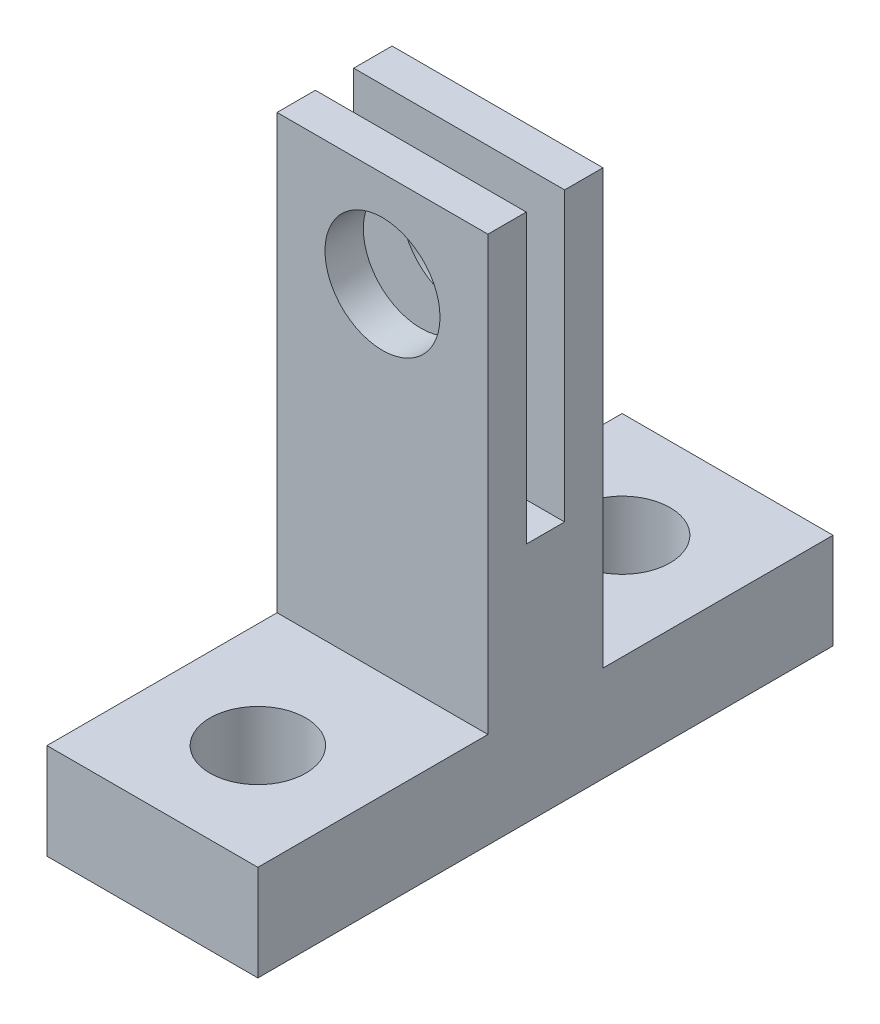
ISO-10303-21;
HEADER;
FILE_DESCRIPTION(('STEP AP214'),'2;1');
FILE_NAME('part.step','',(''),(''),'','','');
FILE_SCHEMA(('AUTOMOTIVE_DESIGN { 1 0 10303 214 1 1 1 1 }'));
ENDSEC;
DATA;
#1=APPLICATION_CONTEXT('core data for automotive mechanical design processes');
#2=APPLICATION_PROTOCOL_DEFINITION('international standard','automotive_design',2000,#1);
#3=PRODUCT_CONTEXT('',#1,'mechanical');
#4=PRODUCT('Part','Part','',(#3));
#5=PRODUCT_RELATED_PRODUCT_CATEGORY('part','',(#4));
#6=PRODUCT_DEFINITION_FORMATION('','',#4);
#7=PRODUCT_DEFINITION_CONTEXT('part definition',#1,'design');
#8=PRODUCT_DEFINITION('design','',#6,#7);
#9=PRODUCT_DEFINITION_SHAPE('','',#8);
#10=(LENGTH_UNIT() NAMED_UNIT(*) SI_UNIT(.MILLI.,.METRE.));
#11=(NAMED_UNIT(*) PLANE_ANGLE_UNIT() SI_UNIT($,.RADIAN.));
#12=(NAMED_UNIT(*) SI_UNIT($,.STERADIAN.) SOLID_ANGLE_UNIT());
#13=UNCERTAINTY_MEASURE_WITH_UNIT(LENGTH_MEASURE(1.E-05),#10,'distance_accuracy_value','');
#14=(GEOMETRIC_REPRESENTATION_CONTEXT(3) GLOBAL_UNCERTAINTY_ASSIGNED_CONTEXT((#13)) GLOBAL_UNIT_ASSIGNED_CONTEXT((#10,
#11,#12)) REPRESENTATION_CONTEXT('',''));
#15=CARTESIAN_POINT('',(0.,0.,0.));
#16=DIRECTION('',(0.,0.,1.));
#17=DIRECTION('',(1.,0.,0.));
#18=AXIS2_PLACEMENT_3D('',#15,#16,#17);
#19=CARTESIAN_POINT('',(2.75,7.5,0.500000000000001));
#20=DIRECTION('',(0.,-1.,0.));
#21=DIRECTION('',(0.,0.,-1.));
#22=AXIS2_PLACEMENT_3D('',#19,#20,#21);
#23=PLANE('',#22);
#24=DIRECTION('',(0.,0.,1.));
#25=VECTOR('',#24,1.);
#26=CARTESIAN_POINT('',(-2.75,7.5,0.500000000000001));
#27=LINE('',#26,#25);
#28=CARTESIAN_POINT('',(-2.75,7.5,0.500000000000001));
#29=VERTEX_POINT('',#28);
#30=CARTESIAN_POINT('',(-2.75,7.5,1.5));
#31=VERTEX_POINT('',#30);
#32=EDGE_CURVE('E154',#29,#31,#27,.T.);
#33=ORIENTED_EDGE('',*,*,#32,.T.);
#34=DIRECTION('',(-1.,0.,0.));
#35=VECTOR('',#34,1.);
#36=CARTESIAN_POINT('',(2.75,7.5,1.5));
#37=LINE('',#36,#35);
#38=CARTESIAN_POINT('',(2.75,7.5,1.5));
#39=VERTEX_POINT('',#38);
#40=EDGE_CURVE('E11',#39,#31,#37,.T.);
#41=ORIENTED_EDGE('',*,*,#40,.F.);
#42=DIRECTION('',(0.,0.,1.));
#43=VECTOR('',#42,1.);
#44=CARTESIAN_POINT('',(2.75,7.5,0.500000000000001));
#45=LINE('',#44,#43);
#46=CARTESIAN_POINT('',(2.75,7.5,0.500000000000001));
#47=VERTEX_POINT('',#46);
#48=EDGE_CURVE('E177',#47,#39,#45,.T.);
#49=ORIENTED_EDGE('',*,*,#48,.F.);
#50=DIRECTION('',(-1.,0.,0.));
#51=VECTOR('',#50,1.);
#52=CARTESIAN_POINT('',(2.75,7.5,0.500000000000001));
#53=LINE('',#52,#51);
#54=EDGE_CURVE('E150',#47,#29,#53,.T.);
#55=ORIENTED_EDGE('',*,*,#54,.T.);
#56=EDGE_LOOP('',(#33,#41,#49,#55));
#57=FACE_BOUND('',#56,.T.);
#58=ADVANCED_FACE('F33',(#57),#23,.F.);
#59=CARTESIAN_POINT('',(2.75,7.5,1.5));
#60=DIRECTION('',(0.,0.,-1.));
#61=DIRECTION('',(0.,1.,0.));
#62=AXIS2_PLACEMENT_3D('',#59,#60,#61);
#63=PLANE('',#62);
#64=CARTESIAN_POINT('',(0.,5.,1.5));
#65=DIRECTION('',(0.,0.,-1.));
#66=DIRECTION('',(0.,1.,0.));
#67=AXIS2_PLACEMENT_3D('',#64,#65,#66);
#68=CIRCLE('',#67,1.5);
#69=CARTESIAN_POINT('',(0.,6.5,1.5));
#70=VERTEX_POINT('',#69);
#71=EDGE_CURVE('E299',#70,#70,#68,.T.);
#72=ORIENTED_EDGE('',*,*,#71,.T.);
#73=EDGE_LOOP('',(#72));
#74=FACE_BOUND('',#73,.T.);
#75=DIRECTION('',(0.,-1.,0.));
#76=VECTOR('',#75,1.);
#77=CARTESIAN_POINT('',(-2.75,7.5,1.5));
#78=LINE('',#77,#76);
#79=CARTESIAN_POINT('',(-2.75,-3.8,1.5));
#80=VERTEX_POINT('',#79);
#81=EDGE_CURVE('E157',#31,#80,#78,.T.);
#82=ORIENTED_EDGE('',*,*,#81,.T.);
#83=DIRECTION('',(-1.,0.,0.));
#84=VECTOR('',#83,1.);
#85=CARTESIAN_POINT('',(2.75,-3.8,1.5));
#86=LINE('',#85,#84);
#87=CARTESIAN_POINT('',(2.75,-3.8,1.5));
#88=VERTEX_POINT('',#87);
#89=EDGE_CURVE('E42',#88,#80,#86,.T.);
#90=ORIENTED_EDGE('',*,*,#89,.F.);
#91=DIRECTION('',(0.,-1.,0.));
#92=VECTOR('',#91,1.);
#93=CARTESIAN_POINT('',(2.75,7.5,1.5));
#94=LINE('',#93,#92);
#95=EDGE_CURVE('E105',#39,#88,#94,.T.);
#96=ORIENTED_EDGE('',*,*,#95,.F.);
#97=ORIENTED_EDGE('',*,*,#40,.T.);
#98=EDGE_LOOP('',(#82,#90,#96,#97));
#99=FACE_BOUND('',#98,.T.);
#100=ADVANCED_FACE('F258',(#74,#99),#63,.F.);
#101=CARTESIAN_POINT('',(2.75,-3.8,7.5));
#102=DIRECTION('',(0.,-1.,0.));
#103=DIRECTION('',(0.,0.,-1.));
#104=AXIS2_PLACEMENT_3D('',#101,#102,#103);
#105=PLANE('',#104);
#106=CARTESIAN_POINT('',(0.,-3.8,4.75));
#107=DIRECTION('',(0.,1.,0.));
#108=DIRECTION('',(0.,0.,1.));
#109=AXIS2_PLACEMENT_3D('',#106,#107,#108);
#110=CIRCLE('',#109,1.25);
#111=CARTESIAN_POINT('',(0.,-3.8,6.));
#112=VERTEX_POINT('',#111);
#113=EDGE_CURVE('E306',#112,#112,#110,.T.);
#114=ORIENTED_EDGE('',*,*,#113,.F.);
#115=EDGE_LOOP('',(#114));
#116=FACE_BOUND('',#115,.T.);
#117=DIRECTION('',(0.,0.,1.));
#118=VECTOR('',#117,1.);
#119=CARTESIAN_POINT('',(-2.75,-3.8,7.5));
#120=LINE('',#119,#118);
#121=CARTESIAN_POINT('',(-2.75,-3.8,7.5));
#122=VERTEX_POINT('',#121);
#123=EDGE_CURVE('E160',#80,#122,#120,.T.);
#124=ORIENTED_EDGE('',*,*,#123,.T.);
#125=DIRECTION('',(-1.,0.,0.));
#126=VECTOR('',#125,1.);
#127=CARTESIAN_POINT('',(2.75,-3.8,7.5));
#128=LINE('',#127,#126);
#129=CARTESIAN_POINT('',(2.75,-3.8,7.5));
#130=VERTEX_POINT('',#129);
#131=EDGE_CURVE('E196',#130,#122,#128,.T.);
#132=ORIENTED_EDGE('',*,*,#131,.F.);
#133=DIRECTION('',(0.,0.,1.));
#134=VECTOR('',#133,1.);
#135=CARTESIAN_POINT('',(2.75,-3.8,7.5));
#136=LINE('',#135,#134);
#137=EDGE_CURVE('E205',#88,#130,#136,.T.);
#138=ORIENTED_EDGE('',*,*,#137,.F.);
#139=ORIENTED_EDGE('',*,*,#89,.T.);
#140=EDGE_LOOP('',(#124,#132,#138,#139));
#141=FACE_BOUND('',#140,.T.);
#142=ADVANCED_FACE('F203',(#116,#141),#105,.F.);
#143=CARTESIAN_POINT('',(2.75,-6.3,7.5));
#144=DIRECTION('',(0.,0.,-1.));
#145=DIRECTION('',(-1.,0.,0.));
#146=AXIS2_PLACEMENT_3D('',#143,#144,#145);
#147=PLANE('',#146);
#148=DIRECTION('',(0.,-1.,0.));
#149=VECTOR('',#148,1.);
#150=CARTESIAN_POINT('',(-2.75,-6.3,7.5));
#151=LINE('',#150,#149);
#152=CARTESIAN_POINT('',(-2.75,-6.3,7.5));
#153=VERTEX_POINT('',#152);
#154=EDGE_CURVE('E162',#122,#153,#151,.T.);
#155=ORIENTED_EDGE('',*,*,#154,.T.);
#156=DIRECTION('',(-1.,0.,0.));
#157=VECTOR('',#156,1.);
#158=CARTESIAN_POINT('',(2.75,-6.3,7.5));
#159=LINE('',#158,#157);
#160=CARTESIAN_POINT('',(2.75,-6.3,7.5));
#161=VERTEX_POINT('',#160);
#162=EDGE_CURVE('E193',#161,#153,#159,.T.);
#163=ORIENTED_EDGE('',*,*,#162,.F.);
#164=DIRECTION('',(0.,-1.,0.));
#165=VECTOR('',#164,1.);
#166=CARTESIAN_POINT('',(2.75,-6.3,7.5));
#167=LINE('',#166,#165);
#168=EDGE_CURVE('E223',#130,#161,#167,.T.);
#169=ORIENTED_EDGE('',*,*,#168,.F.);
#170=ORIENTED_EDGE('',*,*,#131,.T.);
#171=EDGE_LOOP('',(#155,#163,#169,#170));
#172=FACE_BOUND('',#171,.T.);
#173=ADVANCED_FACE('F214',(#172),#147,.F.);
#174=CARTESIAN_POINT('',(2.75,-6.3,7.5));
#175=DIRECTION('',(0.,1.,0.));
#176=DIRECTION('',(0.,0.,1.));
#177=AXIS2_PLACEMENT_3D('',#174,#175,#176);
#178=PLANE('',#177);
#179=CARTESIAN_POINT('',(0.,-6.3,4.75));
#180=DIRECTION('',(0.,1.,0.));
#181=DIRECTION('',(0.,0.,1.));
#182=AXIS2_PLACEMENT_3D('',#179,#180,#181);
#183=CIRCLE('',#182,1.25);
#184=CARTESIAN_POINT('',(0.,-6.3,6.));
#185=VERTEX_POINT('',#184);
#186=EDGE_CURVE('E158',#185,#185,#183,.T.);
#187=ORIENTED_EDGE('',*,*,#186,.T.);
#188=EDGE_LOOP('',(#187));
#189=FACE_BOUND('',#188,.T.);
#190=CARTESIAN_POINT('',(0.,-6.3,-4.75));
#191=DIRECTION('',(0.,1.,0.));
#192=DIRECTION('',(0.,0.,-1.));
#193=AXIS2_PLACEMENT_3D('',#190,#191,#192);
#194=CIRCLE('',#193,1.25);
#195=CARTESIAN_POINT('',(0.,-6.3,-6.));
#196=VERTEX_POINT('',#195);
#197=EDGE_CURVE('E309',#196,#196,#194,.T.);
#198=ORIENTED_EDGE('',*,*,#197,.T.);
#199=EDGE_LOOP('',(#198));
#200=FACE_BOUND('',#199,.T.);
#201=DIRECTION('',(0.,0.,-1.));
#202=VECTOR('',#201,1.);
#203=CARTESIAN_POINT('',(-2.75,-6.3,7.5));
#204=LINE('',#203,#202);
#205=CARTESIAN_POINT('',(-2.75,-6.3,-7.5));
#206=VERTEX_POINT('',#205);
#207=EDGE_CURVE('E164',#153,#206,#204,.T.);
#208=ORIENTED_EDGE('',*,*,#207,.T.);
#209=DIRECTION('',(-1.,0.,0.));
#210=VECTOR('',#209,1.);
#211=CARTESIAN_POINT('',(2.75,-6.3,-7.5));
#212=LINE('',#211,#210);
#213=CARTESIAN_POINT('',(2.75,-6.3,-7.5));
#214=VERTEX_POINT('',#213);
#215=EDGE_CURVE('E190',#214,#206,#212,.T.);
#216=ORIENTED_EDGE('',*,*,#215,.F.);
#217=DIRECTION('',(0.,0.,-1.));
#218=VECTOR('',#217,1.);
#219=CARTESIAN_POINT('',(2.75,-6.3,7.5));
#220=LINE('',#219,#218);
#221=EDGE_CURVE('E220',#161,#214,#220,.T.);
#222=ORIENTED_EDGE('',*,*,#221,.F.);
#223=ORIENTED_EDGE('',*,*,#162,.T.);
#224=EDGE_LOOP('',(#208,#216,#222,#223));
#225=FACE_BOUND('',#224,.T.);
#226=ADVANCED_FACE('F218',(#189,#200,#225),#178,.F.);
#227=CARTESIAN_POINT('',(2.75,-3.8,-7.5));
#228=DIRECTION('',(0.,0.,1.));
#229=DIRECTION('',(1.,0.,0.));
#230=AXIS2_PLACEMENT_3D('',#227,#228,#229);
#231=PLANE('',#230);
#232=DIRECTION('',(0.,1.,0.));
#233=VECTOR('',#232,1.);
#234=CARTESIAN_POINT('',(-2.75,-3.8,-7.5));
#235=LINE('',#234,#233);
#236=CARTESIAN_POINT('',(-2.75,-3.8,-7.5));
#237=VERTEX_POINT('',#236);
#238=EDGE_CURVE('E166',#206,#237,#235,.T.);
#239=ORIENTED_EDGE('',*,*,#238,.T.);
#240=DIRECTION('',(-1.,0.,0.));
#241=VECTOR('',#240,1.);
#242=CARTESIAN_POINT('',(2.75,-3.8,-7.5));
#243=LINE('',#242,#241);
#244=CARTESIAN_POINT('',(2.75,-3.8,-7.5));
#245=VERTEX_POINT('',#244);
#246=EDGE_CURVE('E187',#245,#237,#243,.T.);
#247=ORIENTED_EDGE('',*,*,#246,.F.);
#248=DIRECTION('',(0.,1.,0.));
#249=VECTOR('',#248,1.);
#250=CARTESIAN_POINT('',(2.75,-3.8,-7.5));
#251=LINE('',#250,#249);
#252=EDGE_CURVE('E222',#214,#245,#251,.T.);
#253=ORIENTED_EDGE('',*,*,#252,.F.);
#254=ORIENTED_EDGE('',*,*,#215,.T.);
#255=EDGE_LOOP('',(#239,#247,#253,#254));
#256=FACE_BOUND('',#255,.T.);
#257=ADVANCED_FACE('F274',(#256),#231,.F.);
#258=CARTESIAN_POINT('',(2.75,-3.8,-1.5));
#259=DIRECTION('',(0.,-1.,0.));
#260=DIRECTION('',(0.,0.,-1.));
#261=AXIS2_PLACEMENT_3D('',#258,#259,#260);
#262=PLANE('',#261);
#263=CARTESIAN_POINT('',(0.,-3.8,-4.75));
#264=DIRECTION('',(0.,1.,0.));
#265=DIRECTION('',(0.,0.,-1.));
#266=AXIS2_PLACEMENT_3D('',#263,#264,#265);
#267=CIRCLE('',#266,1.25);
#268=CARTESIAN_POINT('',(0.,-3.8,-6.));
#269=VERTEX_POINT('',#268);
#270=EDGE_CURVE('E303',#269,#269,#267,.T.);
#271=ORIENTED_EDGE('',*,*,#270,.F.);
#272=EDGE_LOOP('',(#271));
#273=FACE_BOUND('',#272,.T.);
#274=DIRECTION('',(0.,0.,1.));
#275=VECTOR('',#274,1.);
#276=CARTESIAN_POINT('',(-2.75,-3.8,-1.5));
#277=LINE('',#276,#275);
#278=CARTESIAN_POINT('',(-2.75,-3.8,-1.5));
#279=VERTEX_POINT('',#278);
#280=EDGE_CURVE('E168',#237,#279,#277,.T.);
#281=ORIENTED_EDGE('',*,*,#280,.T.);
#282=DIRECTION('',(-1.,0.,0.));
#283=VECTOR('',#282,1.);
#284=CARTESIAN_POINT('',(2.75,-3.8,-1.5));
#285=LINE('',#284,#283);
#286=CARTESIAN_POINT('',(2.75,-3.8,-1.5));
#287=VERTEX_POINT('',#286);
#288=EDGE_CURVE('E184',#287,#279,#285,.T.);
#289=ORIENTED_EDGE('',*,*,#288,.F.);
#290=DIRECTION('',(0.,0.,1.));
#291=VECTOR('',#290,1.);
#292=CARTESIAN_POINT('',(2.75,-3.8,-1.5));
#293=LINE('',#292,#291);
#294=EDGE_CURVE('E225',#245,#287,#293,.T.);
#295=ORIENTED_EDGE('',*,*,#294,.F.);
#296=ORIENTED_EDGE('',*,*,#246,.T.);
#297=EDGE_LOOP('',(#281,#289,#295,#296));
#298=FACE_BOUND('',#297,.T.);
#299=ADVANCED_FACE('F278',(#273,#298),#262,.F.);
#300=CARTESIAN_POINT('',(2.75,7.5,-1.5));
#301=DIRECTION('',(0.,0.,1.));
#302=DIRECTION('',(0.,-1.,0.));
#303=AXIS2_PLACEMENT_3D('',#300,#301,#302);
#304=PLANE('',#303);
#305=CARTESIAN_POINT('',(0.,5.,-1.5));
#306=DIRECTION('',(0.,0.,1.));
#307=DIRECTION('',(0.,-1.,0.));
#308=AXIS2_PLACEMENT_3D('',#305,#306,#307);
#309=CIRCLE('',#308,1.5);
#310=CARTESIAN_POINT('',(0.,3.5,-1.5));
#311=VERTEX_POINT('',#310);
#312=EDGE_CURVE('E296',#311,#311,#309,.T.);
#313=ORIENTED_EDGE('',*,*,#312,.T.);
#314=EDGE_LOOP('',(#313));
#315=FACE_BOUND('',#314,.T.);
#316=DIRECTION('',(0.,1.,0.));
#317=VECTOR('',#316,1.);
#318=CARTESIAN_POINT('',(-2.75,7.5,-1.5));
#319=LINE('',#318,#317);
#320=CARTESIAN_POINT('',(-2.75,7.5,-1.5));
#321=VERTEX_POINT('',#320);
#322=EDGE_CURVE('E170',#279,#321,#319,.T.);
#323=ORIENTED_EDGE('',*,*,#322,.T.);
#324=DIRECTION('',(-1.,0.,0.));
#325=VECTOR('',#324,1.);
#326=CARTESIAN_POINT('',(2.75,7.5,-1.5));
#327=LINE('',#326,#325);
#328=CARTESIAN_POINT('',(2.75,7.5,-1.5));
#329=VERTEX_POINT('',#328);
#330=EDGE_CURVE('E181',#329,#321,#327,.T.);
#331=ORIENTED_EDGE('',*,*,#330,.F.);
#332=DIRECTION('',(0.,1.,0.));
#333=VECTOR('',#332,1.);
#334=CARTESIAN_POINT('',(2.75,7.5,-1.5));
#335=LINE('',#334,#333);
#336=EDGE_CURVE('E231',#287,#329,#335,.T.);
#337=ORIENTED_EDGE('',*,*,#336,.F.);
#338=ORIENTED_EDGE('',*,*,#288,.T.);
#339=EDGE_LOOP('',(#323,#331,#337,#338));
#340=FACE_BOUND('',#339,.T.);
#341=ADVANCED_FACE('F237',(#315,#340),#304,.F.);
#342=CARTESIAN_POINT('',(2.75,7.5,-0.500000000000002));
#343=DIRECTION('',(0.,-1.,0.));
#344=DIRECTION('',(0.,0.,-1.));
#345=AXIS2_PLACEMENT_3D('',#342,#343,#344);
#346=PLANE('',#345);
#347=DIRECTION('',(0.,0.,1.));
#348=VECTOR('',#347,1.);
#349=CARTESIAN_POINT('',(-2.75,7.5,-0.500000000000002));
#350=LINE('',#349,#348);
#351=CARTESIAN_POINT('',(-2.75,7.5,-0.500000000000002));
#352=VERTEX_POINT('',#351);
#353=EDGE_CURVE('E172',#321,#352,#350,.T.);
#354=ORIENTED_EDGE('',*,*,#353,.T.);
#355=DIRECTION('',(-1.,0.,0.));
#356=VECTOR('',#355,1.);
#357=CARTESIAN_POINT('',(2.75,7.5,-0.500000000000002));
#358=LINE('',#357,#356);
#359=CARTESIAN_POINT('',(2.75,7.5,-0.500000000000002));
#360=VERTEX_POINT('',#359);
#361=EDGE_CURVE('E145',#360,#352,#358,.T.);
#362=ORIENTED_EDGE('',*,*,#361,.F.);
#363=DIRECTION('',(0.,0.,1.));
#364=VECTOR('',#363,1.);
#365=CARTESIAN_POINT('',(2.75,7.5,-0.500000000000002));
#366=LINE('',#365,#364);
#367=EDGE_CURVE('E136',#329,#360,#366,.T.);
#368=ORIENTED_EDGE('',*,*,#367,.F.);
#369=ORIENTED_EDGE('',*,*,#330,.T.);
#370=EDGE_LOOP('',(#354,#362,#368,#369));
#371=FACE_BOUND('',#370,.T.);
#372=ADVANCED_FACE('F241',(#371),#346,.F.);
#373=CARTESIAN_POINT('',(2.75,7.5,-0.500000000000002));
#374=DIRECTION('',(0.,0.,-1.));
#375=DIRECTION('',(0.,1.,0.));
#376=AXIS2_PLACEMENT_3D('',#373,#374,#375);
#377=PLANE('',#376);
#378=CARTESIAN_POINT('',(0.,5.,-0.500000000000001));
#379=DIRECTION('',(0.,0.,-1.));
#380=DIRECTION('',(0.,1.,0.));
#381=AXIS2_PLACEMENT_3D('',#378,#379,#380);
#382=CIRCLE('',#381,1.5);
#383=CARTESIAN_POINT('',(0.,6.5,-0.500000000000001));
#384=VERTEX_POINT('',#383);
#385=EDGE_CURVE('E294',#384,#384,#382,.T.);
#386=ORIENTED_EDGE('',*,*,#385,.T.);
#387=EDGE_LOOP('',(#386));
#388=FACE_BOUND('',#387,.T.);
#389=DIRECTION('',(0.,-1.,0.));
#390=VECTOR('',#389,1.);
#391=CARTESIAN_POINT('',(-2.75,7.5,-0.500000000000002));
#392=LINE('',#391,#390);
#393=CARTESIAN_POINT('',(-2.75,0.,-0.500000000000002));
#394=VERTEX_POINT('',#393);
#395=EDGE_CURVE('E144',#352,#394,#392,.T.);
#396=ORIENTED_EDGE('',*,*,#395,.T.);
#397=DIRECTION('',(-1.,0.,0.));
#398=VECTOR('',#397,1.);
#399=CARTESIAN_POINT('',(2.75,0.,-0.500000000000002));
#400=LINE('',#399,#398);
#401=CARTESIAN_POINT('',(2.75,0.,-0.500000000000002));
#402=VERTEX_POINT('',#401);
#403=EDGE_CURVE('E141',#402,#394,#400,.T.);
#404=ORIENTED_EDGE('',*,*,#403,.F.);
#405=DIRECTION('',(0.,-1.,0.));
#406=VECTOR('',#405,1.);
#407=CARTESIAN_POINT('',(2.75,7.5,-0.500000000000002));
#408=LINE('',#407,#406);
#409=EDGE_CURVE('E130',#360,#402,#408,.T.);
#410=ORIENTED_EDGE('',*,*,#409,.F.);
#411=ORIENTED_EDGE('',*,*,#361,.T.);
#412=EDGE_LOOP('',(#396,#404,#410,#411));
#413=FACE_BOUND('',#412,.T.);
#414=ADVANCED_FACE('F142',(#388,#413),#377,.F.);
#415=CARTESIAN_POINT('',(2.75,0.,0.5));
#416=DIRECTION('',(0.,-1.,0.));
#417=DIRECTION('',(0.,0.,-1.));
#418=AXIS2_PLACEMENT_3D('',#415,#416,#417);
#419=PLANE('',#418);
#420=DIRECTION('',(0.,0.,1.));
#421=VECTOR('',#420,1.);
#422=CARTESIAN_POINT('',(-2.75,0.,0.5));
#423=LINE('',#422,#421);
#424=CARTESIAN_POINT('',(-2.75,0.,0.5));
#425=VERTEX_POINT('',#424);
#426=EDGE_CURVE('E91',#394,#425,#423,.T.);
#427=ORIENTED_EDGE('',*,*,#426,.T.);
#428=DIRECTION('',(-1.,0.,0.));
#429=VECTOR('',#428,1.);
#430=CARTESIAN_POINT('',(2.75,0.,0.5));
#431=LINE('',#430,#429);
#432=CARTESIAN_POINT('',(2.75,0.,0.5));
#433=VERTEX_POINT('',#432);
#434=EDGE_CURVE('E146',#433,#425,#431,.T.);
#435=ORIENTED_EDGE('',*,*,#434,.F.);
#436=DIRECTION('',(0.,0.,1.));
#437=VECTOR('',#436,1.);
#438=CARTESIAN_POINT('',(2.75,0.,0.5));
#439=LINE('',#438,#437);
#440=EDGE_CURVE('E134',#402,#433,#439,.T.);
#441=ORIENTED_EDGE('',*,*,#440,.F.);
#442=ORIENTED_EDGE('',*,*,#403,.T.);
#443=EDGE_LOOP('',(#427,#435,#441,#442));
#444=FACE_BOUND('',#443,.T.);
#445=ADVANCED_FACE('F148',(#444),#419,.F.);
#446=CARTESIAN_POINT('',(2.75,7.5,0.500000000000001));
#447=DIRECTION('',(0.,0.,1.));
#448=DIRECTION('',(0.,-1.,0.));
#449=AXIS2_PLACEMENT_3D('',#446,#447,#448);
#450=PLANE('',#449);
#451=CARTESIAN_POINT('',(0.,5.,0.5));
#452=DIRECTION('',(0.,0.,1.));
#453=DIRECTION('',(0.,-1.,0.));
#454=AXIS2_PLACEMENT_3D('',#451,#452,#453);
#455=CIRCLE('',#454,1.5);
#456=CARTESIAN_POINT('',(0.,3.5,0.5));
#457=VERTEX_POINT('',#456);
#458=EDGE_CURVE('E36',#457,#457,#455,.T.);
#459=ORIENTED_EDGE('',*,*,#458,.T.);
#460=EDGE_LOOP('',(#459));
#461=FACE_BOUND('',#460,.T.);
#462=DIRECTION('',(0.,1.,0.));
#463=VECTOR('',#462,1.);
#464=CARTESIAN_POINT('',(-2.75,7.5,0.500000000000001));
#465=LINE('',#464,#463);
#466=EDGE_CURVE('E97',#425,#29,#465,.T.);
#467=ORIENTED_EDGE('',*,*,#466,.T.);
#468=ORIENTED_EDGE('',*,*,#54,.F.);
#469=DIRECTION('',(0.,1.,0.));
#470=VECTOR('',#469,1.);
#471=CARTESIAN_POINT('',(2.75,7.5,0.500000000000001));
#472=LINE('',#471,#470);
#473=EDGE_CURVE('E50',#433,#47,#472,.T.);
#474=ORIENTED_EDGE('',*,*,#473,.F.);
#475=ORIENTED_EDGE('',*,*,#434,.T.);
#476=EDGE_LOOP('',(#467,#468,#474,#475));
#477=FACE_BOUND('',#476,.T.);
#478=ADVANCED_FACE('F245',(#461,#477),#450,.F.);
#479=CARTESIAN_POINT('',(2.75,0.,0.));
#480=DIRECTION('',(1.,0.,0.));
#481=DIRECTION('',(0.,0.,-1.));
#482=AXIS2_PLACEMENT_3D('',#479,#480,#481);
#483=PLANE('',#482);
#484=ORIENTED_EDGE('',*,*,#48,.T.);
#485=ORIENTED_EDGE('',*,*,#95,.T.);
#486=ORIENTED_EDGE('',*,*,#137,.T.);
#487=ORIENTED_EDGE('',*,*,#168,.T.);
#488=ORIENTED_EDGE('',*,*,#221,.T.);
#489=ORIENTED_EDGE('',*,*,#252,.T.);
#490=ORIENTED_EDGE('',*,*,#294,.T.);
#491=ORIENTED_EDGE('',*,*,#336,.T.);
#492=ORIENTED_EDGE('',*,*,#367,.T.);
#493=ORIENTED_EDGE('',*,*,#409,.T.);
#494=ORIENTED_EDGE('',*,*,#440,.T.);
#495=ORIENTED_EDGE('',*,*,#473,.T.);
#496=EDGE_LOOP('',(#484,#485,#486,#487,#488,#489,#490,#491,#492,#493,#494,#495));
#497=FACE_BOUND('',#496,.T.);
#498=ADVANCED_FACE('F132',(#497),#483,.T.);
#499=CARTESIAN_POINT('',(-2.75,0.,0.));
#500=DIRECTION('',(1.,0.,0.));
#501=DIRECTION('',(0.,0.,-1.));
#502=AXIS2_PLACEMENT_3D('',#499,#500,#501);
#503=PLANE('',#502);
#504=ORIENTED_EDGE('',*,*,#32,.F.);
#505=ORIENTED_EDGE('',*,*,#466,.F.);
#506=ORIENTED_EDGE('',*,*,#426,.F.);
#507=ORIENTED_EDGE('',*,*,#395,.F.);
#508=ORIENTED_EDGE('',*,*,#353,.F.);
#509=ORIENTED_EDGE('',*,*,#322,.F.);
#510=ORIENTED_EDGE('',*,*,#280,.F.);
#511=ORIENTED_EDGE('',*,*,#238,.F.);
#512=ORIENTED_EDGE('',*,*,#207,.F.);
#513=ORIENTED_EDGE('',*,*,#154,.F.);
#514=ORIENTED_EDGE('',*,*,#123,.F.);
#515=ORIENTED_EDGE('',*,*,#81,.F.);
#516=EDGE_LOOP('',(#504,#505,#506,#507,#508,#509,#510,#511,#512,#513,#514,#515));
#517=FACE_BOUND('',#516,.T.);
#518=ADVANCED_FACE('F209',(#517),#503,.F.);
#519=CARTESIAN_POINT('',(0.,-6.3,-4.75));
#520=DIRECTION('',(0.,1.,0.));
#521=DIRECTION('',(0.,0.,1.));
#522=AXIS2_PLACEMENT_3D('',#519,#520,#521);
#523=CYLINDRICAL_SURFACE('',#522,1.25);
#524=ORIENTED_EDGE('',*,*,#197,.F.);
#525=EDGE_LOOP('',(#524));
#526=FACE_BOUND('',#525,.T.);
#527=ORIENTED_EDGE('',*,*,#270,.T.);
#528=EDGE_LOOP('',(#527));
#529=FACE_BOUND('',#528,.T.);
#530=ADVANCED_FACE('F317',(#526,#529),#523,.F.);
#531=CARTESIAN_POINT('',(0.,-6.3,4.75));
#532=DIRECTION('',(0.,1.,0.));
#533=DIRECTION('',(0.,0.,1.));
#534=AXIS2_PLACEMENT_3D('',#531,#532,#533);
#535=CYLINDRICAL_SURFACE('',#534,1.25);
#536=ORIENTED_EDGE('',*,*,#186,.F.);
#537=EDGE_LOOP('',(#536));
#538=FACE_BOUND('',#537,.T.);
#539=ORIENTED_EDGE('',*,*,#113,.T.);
#540=EDGE_LOOP('',(#539));
#541=FACE_BOUND('',#540,.T.);
#542=ADVANCED_FACE('F322',(#538,#541),#535,.F.);
#543=CARTESIAN_POINT('',(0.,5.,-7.5));
#544=DIRECTION('',(0.,0.,1.));
#545=DIRECTION('',(1.,0.,0.));
#546=AXIS2_PLACEMENT_3D('',#543,#544,#545);
#547=CYLINDRICAL_SURFACE('',#546,1.5);
#548=ORIENTED_EDGE('',*,*,#458,.F.);
#549=EDGE_LOOP('',(#548));
#550=FACE_BOUND('',#549,.T.);
#551=ORIENTED_EDGE('',*,*,#71,.F.);
#552=EDGE_LOOP('',(#551));
#553=FACE_BOUND('',#552,.T.);
#554=ADVANCED_FACE('F329',(#550,#553),#547,.F.);
#555=ORIENTED_EDGE('',*,*,#385,.F.);
#556=EDGE_LOOP('',(#555));
#557=FACE_BOUND('',#556,.T.);
#558=ORIENTED_EDGE('',*,*,#312,.F.);
#559=EDGE_LOOP('',(#558));
#560=FACE_BOUND('',#559,.T.);
#561=ADVANCED_FACE('F335',(#557,#560),#547,.F.);
#562=CLOSED_SHELL('',(#58,#100,#142,#173,#226,#257,#299,#341,#372,#414,#445,#478,#498,#518,#530,
#542,#554,#561));
#563=MANIFOLD_SOLID_BREP('B2',#562);
#564=ADVANCED_BREP_SHAPE_REPRESENTATION('',(#18,#563),#14);
#565=SHAPE_DEFINITION_REPRESENTATION(#9,#564);
ENDSEC;
END-ISO-10303-21;
